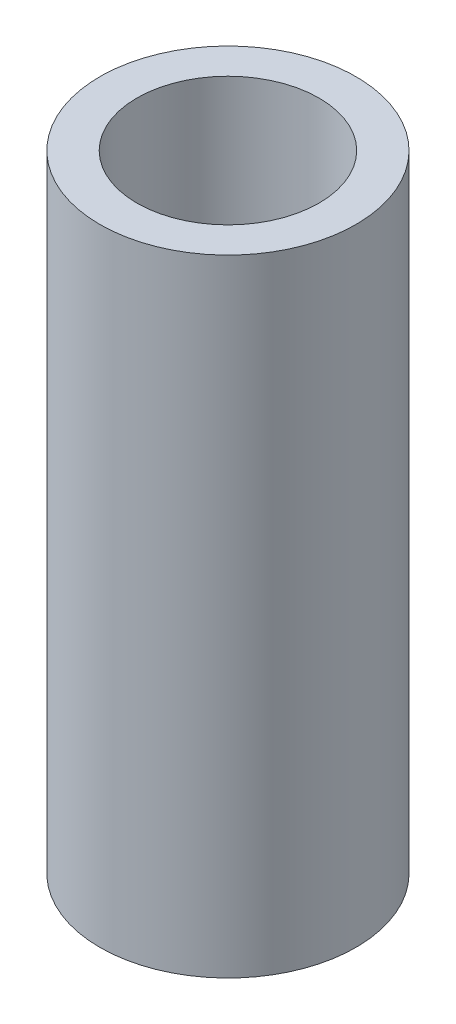
ISO-10303-21;
HEADER;
FILE_DESCRIPTION(('STEP AP214'),'2;1');
FILE_NAME('part.step','',(''),(''),'','','');
FILE_SCHEMA(('AUTOMOTIVE_DESIGN { 1 0 10303 214 1 1 1 1 }'));
ENDSEC;
DATA;
#1=APPLICATION_CONTEXT('core data for automotive mechanical design processes');
#2=APPLICATION_PROTOCOL_DEFINITION('international standard','automotive_design',2000,#1);
#3=PRODUCT_CONTEXT('',#1,'mechanical');
#4=PRODUCT('Part','Part','',(#3));
#5=PRODUCT_RELATED_PRODUCT_CATEGORY('part','',(#4));
#6=PRODUCT_DEFINITION_FORMATION('','',#4);
#7=PRODUCT_DEFINITION_CONTEXT('part definition',#1,'design');
#8=PRODUCT_DEFINITION('design','',#6,#7);
#9=PRODUCT_DEFINITION_SHAPE('','',#8);
#10=(LENGTH_UNIT() NAMED_UNIT(*) SI_UNIT(.MILLI.,.METRE.));
#11=(NAMED_UNIT(*) PLANE_ANGLE_UNIT() SI_UNIT($,.RADIAN.));
#12=(NAMED_UNIT(*) SI_UNIT($,.STERADIAN.) SOLID_ANGLE_UNIT());
#13=UNCERTAINTY_MEASURE_WITH_UNIT(LENGTH_MEASURE(1.E-05),#10,'distance_accuracy_value','');
#14=(GEOMETRIC_REPRESENTATION_CONTEXT(3) GLOBAL_UNCERTAINTY_ASSIGNED_CONTEXT((#13)) GLOBAL_UNIT_ASSIGNED_CONTEXT((#10,
#11,#12)) REPRESENTATION_CONTEXT('',''));
#15=CARTESIAN_POINT('',(0.,0.,0.));
#16=DIRECTION('',(0.,0.,1.));
#17=DIRECTION('',(1.,0.,0.));
#18=AXIS2_PLACEMENT_3D('',#15,#16,#17);
#19=CARTESIAN_POINT('',(0.,5.5,0.));
#20=DIRECTION('',(0.,1.,0.));
#21=DIRECTION('',(0.,0.,1.));
#22=AXIS2_PLACEMENT_3D('',#19,#20,#21);
#23=PLANE('',#22);
#24=CARTESIAN_POINT('',(0.,5.5,0.));
#25=DIRECTION('',(0.,1.,0.));
#26=DIRECTION('',(0.,0.,1.));
#27=AXIS2_PLACEMENT_3D('',#24,#25,#26);
#28=CIRCLE('',#27,2.25);
#29=CARTESIAN_POINT('',(0.,5.5,2.25));
#30=VERTEX_POINT('',#29);
#31=EDGE_CURVE('E10',#30,#30,#28,.T.);
#32=ORIENTED_EDGE('',*,*,#31,.T.);
#33=EDGE_LOOP('',(#32));
#34=FACE_BOUND('',#33,.T.);
#35=CARTESIAN_POINT('',(0.,5.5,0.));
#36=DIRECTION('',(0.,1.,0.));
#37=DIRECTION('',(0.,0.,1.));
#38=AXIS2_PLACEMENT_3D('',#35,#36,#37);
#39=CIRCLE('',#38,1.6);
#40=CARTESIAN_POINT('',(0.,5.5,1.6));
#41=VERTEX_POINT('',#40);
#42=EDGE_CURVE('E43',#41,#41,#39,.T.);
#43=ORIENTED_EDGE('',*,*,#42,.F.);
#44=EDGE_LOOP('',(#43));
#45=FACE_BOUND('',#44,.T.);
#46=ADVANCED_FACE('F32',(#34,#45),#23,.T.);
#47=CARTESIAN_POINT('',(0.,-5.5,0.));
#48=DIRECTION('',(0.,1.,0.));
#49=DIRECTION('',(0.,0.,1.));
#50=AXIS2_PLACEMENT_3D('',#47,#48,#49);
#51=PLANE('',#50);
#52=CARTESIAN_POINT('',(0.,-5.5,0.));
#53=DIRECTION('',(0.,1.,0.));
#54=DIRECTION('',(0.,0.,1.));
#55=AXIS2_PLACEMENT_3D('',#52,#53,#54);
#56=CIRCLE('',#55,2.25);
#57=CARTESIAN_POINT('',(0.,-5.5,2.25));
#58=VERTEX_POINT('',#57);
#59=EDGE_CURVE('E36',#58,#58,#56,.T.);
#60=ORIENTED_EDGE('',*,*,#59,.F.);
#61=EDGE_LOOP('',(#60));
#62=FACE_BOUND('',#61,.T.);
#63=CARTESIAN_POINT('',(0.,-5.5,0.));
#64=DIRECTION('',(0.,1.,0.));
#65=DIRECTION('',(0.,0.,1.));
#66=AXIS2_PLACEMENT_3D('',#63,#64,#65);
#67=CIRCLE('',#66,1.6);
#68=CARTESIAN_POINT('',(0.,-5.5,1.6));
#69=VERTEX_POINT('',#68);
#70=EDGE_CURVE('E45',#69,#69,#67,.T.);
#71=ORIENTED_EDGE('',*,*,#70,.T.);
#72=EDGE_LOOP('',(#71));
#73=FACE_BOUND('',#72,.T.);
#74=ADVANCED_FACE('F55',(#62,#73),#51,.F.);
#75=CARTESIAN_POINT('',(0.,5.5,0.));
#76=DIRECTION('',(0.,-1.,0.));
#77=DIRECTION('',(0.,0.,-1.));
#78=AXIS2_PLACEMENT_3D('',#75,#76,#77);
#79=CYLINDRICAL_SURFACE('',#78,2.25);
#80=ORIENTED_EDGE('',*,*,#31,.F.);
#81=EDGE_LOOP('',(#80));
#82=FACE_BOUND('',#81,.T.);
#83=ORIENTED_EDGE('',*,*,#59,.T.);
#84=EDGE_LOOP('',(#83));
#85=FACE_BOUND('',#84,.T.);
#86=ADVANCED_FACE('F34',(#82,#85),#79,.T.);
#87=CARTESIAN_POINT('',(0.,5.5,0.));
#88=DIRECTION('',(0.,-1.,0.));
#89=DIRECTION('',(0.,0.,-1.));
#90=AXIS2_PLACEMENT_3D('',#87,#88,#89);
#91=CYLINDRICAL_SURFACE('',#90,1.6);
#92=ORIENTED_EDGE('',*,*,#42,.T.);
#93=EDGE_LOOP('',(#92));
#94=FACE_BOUND('',#93,.T.);
#95=ORIENTED_EDGE('',*,*,#70,.F.);
#96=EDGE_LOOP('',(#95));
#97=FACE_BOUND('',#96,.T.);
#98=ADVANCED_FACE('F51',(#94,#97),#91,.F.);
#99=CLOSED_SHELL('',(#46,#74,#86,#98));
#100=MANIFOLD_SOLID_BREP('B2',#99);
#101=ADVANCED_BREP_SHAPE_REPRESENTATION('',(#18,#100),#14);
#102=SHAPE_DEFINITION_REPRESENTATION(#9,#101);
ENDSEC;
END-ISO-10303-21;
